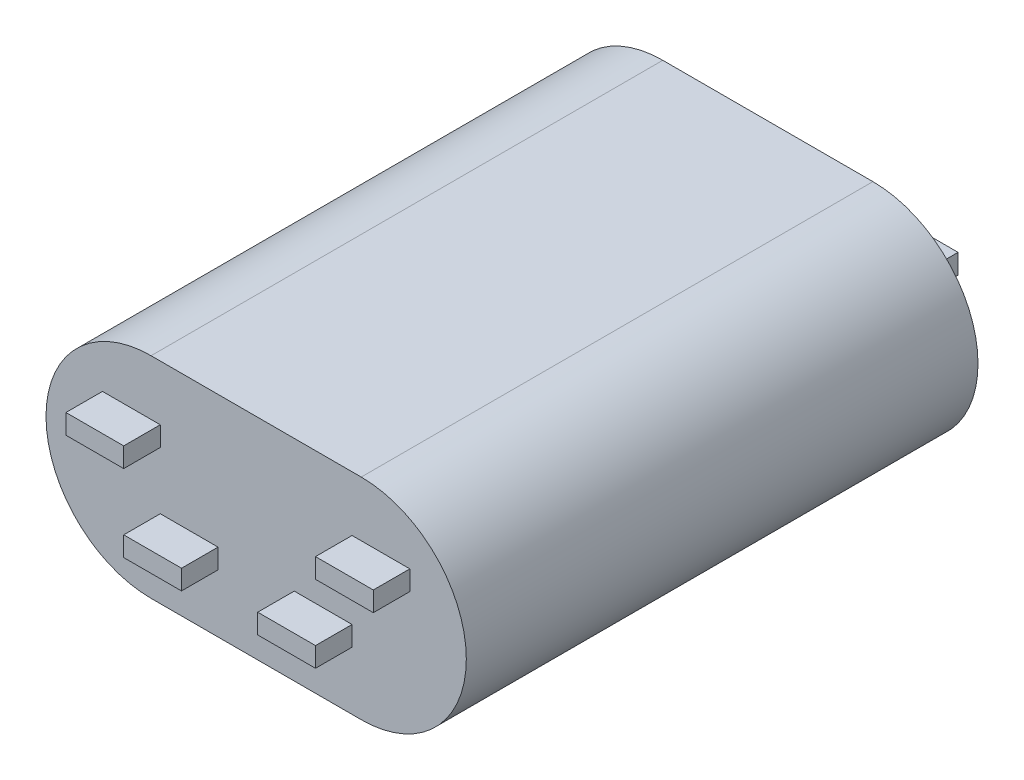
ISO-10303-21;
HEADER;
FILE_DESCRIPTION(('STEP AP214'),'2;1');
FILE_NAME('part.step','',(''),(''),'','','');
FILE_SCHEMA(('AUTOMOTIVE_DESIGN { 1 0 10303 214 1 1 1 1 }'));
ENDSEC;
DATA;
#1=APPLICATION_CONTEXT('core data for automotive mechanical design processes');
#2=APPLICATION_PROTOCOL_DEFINITION('international standard','automotive_design',2000,#1);
#3=PRODUCT_CONTEXT('',#1,'mechanical');
#4=PRODUCT('Part','Part','',(#3));
#5=PRODUCT_RELATED_PRODUCT_CATEGORY('part','',(#4));
#6=PRODUCT_DEFINITION_FORMATION('','',#4);
#7=PRODUCT_DEFINITION_CONTEXT('part definition',#1,'design');
#8=PRODUCT_DEFINITION('design','',#6,#7);
#9=PRODUCT_DEFINITION_SHAPE('','',#8);
#10=(LENGTH_UNIT() NAMED_UNIT(*) SI_UNIT(.MILLI.,.METRE.));
#11=(NAMED_UNIT(*) PLANE_ANGLE_UNIT() SI_UNIT($,.RADIAN.));
#12=(NAMED_UNIT(*) SI_UNIT($,.STERADIAN.) SOLID_ANGLE_UNIT());
#13=UNCERTAINTY_MEASURE_WITH_UNIT(LENGTH_MEASURE(1.E-05),#10,'distance_accuracy_value','');
#14=(GEOMETRIC_REPRESENTATION_CONTEXT(3) GLOBAL_UNCERTAINTY_ASSIGNED_CONTEXT((#13)) GLOBAL_UNIT_ASSIGNED_CONTEXT((#10,
#11,#12)) REPRESENTATION_CONTEXT('',''));
#15=CARTESIAN_POINT('',(0.,0.,0.));
#16=DIRECTION('',(0.,0.,1.));
#17=DIRECTION('',(1.,0.,0.));
#18=AXIS2_PLACEMENT_3D('',#15,#16,#17);
#19=CARTESIAN_POINT('',(5.75,8.75,30.));
#20=DIRECTION('',(0.,0.,-1.));
#21=DIRECTION('',(-1.,0.,0.));
#22=AXIS2_PLACEMENT_3D('',#19,#20,#21);
#23=CYLINDRICAL_SURFACE('',#22,5.75);
#24=CARTESIAN_POINT('',(5.75,8.75,2.));
#25=DIRECTION('',(0.,0.,1.));
#26=DIRECTION('',(1.,0.,0.));
#27=AXIS2_PLACEMENT_3D('',#24,#25,#26);
#28=CIRCLE('',#27,5.75);
#29=CARTESIAN_POINT('',(5.75,3.,2.));
#30=VERTEX_POINT('',#29);
#31=CARTESIAN_POINT('',(5.75,14.5,2.));
#32=VERTEX_POINT('',#31);
#33=EDGE_CURVE('E486',#30,#32,#28,.T.);
#34=ORIENTED_EDGE('',*,*,#33,.T.);
#35=DIRECTION('',(0.,0.,-1.));
#36=VECTOR('',#35,1.);
#37=CARTESIAN_POINT('',(5.75,14.5,30.));
#38=LINE('',#37,#36);
#39=CARTESIAN_POINT('',(5.75,14.5,30.));
#40=VERTEX_POINT('',#39);
#41=EDGE_CURVE('E513',#40,#32,#38,.T.);
#42=ORIENTED_EDGE('',*,*,#41,.F.);
#43=CARTESIAN_POINT('',(5.75,8.75,30.));
#44=DIRECTION('',(0.,0.,1.));
#45=DIRECTION('',(1.,0.,0.));
#46=AXIS2_PLACEMENT_3D('',#43,#44,#45);
#47=CIRCLE('',#46,5.75);
#48=CARTESIAN_POINT('',(5.75,3.,30.));
#49=VERTEX_POINT('',#48);
#50=EDGE_CURVE('E487',#49,#40,#47,.T.);
#51=ORIENTED_EDGE('',*,*,#50,.F.);
#52=DIRECTION('',(0.,0.,-1.));
#53=VECTOR('',#52,1.);
#54=CARTESIAN_POINT('',(5.75,3.,30.));
#55=LINE('',#54,#53);
#56=EDGE_CURVE('E497',#49,#30,#55,.T.);
#57=ORIENTED_EDGE('',*,*,#56,.T.);
#58=EDGE_LOOP('',(#34,#42,#51,#57));
#59=FACE_BOUND('',#58,.T.);
#60=ADVANCED_FACE('F41',(#59),#23,.T.);
#61=CARTESIAN_POINT('',(5.75,14.5,30.));
#62=DIRECTION('',(0.,-1.,0.));
#63=DIRECTION('',(1.,0.,0.));
#64=AXIS2_PLACEMENT_3D('',#61,#62,#63);
#65=PLANE('',#64);
#66=DIRECTION('',(-1.,0.,0.));
#67=VECTOR('',#66,1.);
#68=CARTESIAN_POINT('',(5.75,14.5,2.));
#69=LINE('',#68,#67);
#70=CARTESIAN_POINT('',(-5.74999999999999,14.5,2.));
#71=VERTEX_POINT('',#70);
#72=EDGE_CURVE('E500',#32,#71,#69,.T.);
#73=ORIENTED_EDGE('',*,*,#72,.T.);
#74=DIRECTION('',(0.,0.,-1.));
#75=VECTOR('',#74,1.);
#76=CARTESIAN_POINT('',(-5.74999999999999,14.5,30.));
#77=LINE('',#76,#75);
#78=CARTESIAN_POINT('',(-5.74999999999999,14.5,30.));
#79=VERTEX_POINT('',#78);
#80=EDGE_CURVE('E510',#79,#71,#77,.T.);
#81=ORIENTED_EDGE('',*,*,#80,.F.);
#82=DIRECTION('',(-1.,0.,0.));
#83=VECTOR('',#82,1.);
#84=CARTESIAN_POINT('',(5.75,14.5,30.));
#85=LINE('',#84,#83);
#86=EDGE_CURVE('E490',#40,#79,#85,.T.);
#87=ORIENTED_EDGE('',*,*,#86,.F.);
#88=ORIENTED_EDGE('',*,*,#41,.T.);
#89=EDGE_LOOP('',(#73,#81,#87,#88));
#90=FACE_BOUND('',#89,.T.);
#91=ADVANCED_FACE('F579',(#90),#65,.F.);
#92=CARTESIAN_POINT('',(-5.74999999999999,8.75,30.));
#93=DIRECTION('',(0.,0.,-1.));
#94=DIRECTION('',(-1.,0.,0.));
#95=AXIS2_PLACEMENT_3D('',#92,#93,#94);
#96=CYLINDRICAL_SURFACE('',#95,5.75);
#97=CARTESIAN_POINT('',(-5.74999999999999,8.75,2.));
#98=DIRECTION('',(0.,0.,1.));
#99=DIRECTION('',(1.,0.,0.));
#100=AXIS2_PLACEMENT_3D('',#97,#98,#99);
#101=CIRCLE('',#100,5.75);
#102=CARTESIAN_POINT('',(-5.74999999999999,3.,2.));
#103=VERTEX_POINT('',#102);
#104=EDGE_CURVE('E502',#71,#103,#101,.T.);
#105=ORIENTED_EDGE('',*,*,#104,.T.);
#106=DIRECTION('',(0.,0.,-1.));
#107=VECTOR('',#106,1.);
#108=CARTESIAN_POINT('',(-5.74999999999999,3.,30.));
#109=LINE('',#108,#107);
#110=CARTESIAN_POINT('',(-5.74999999999999,3.,30.));
#111=VERTEX_POINT('',#110);
#112=EDGE_CURVE('E507',#111,#103,#109,.T.);
#113=ORIENTED_EDGE('',*,*,#112,.F.);
#114=CARTESIAN_POINT('',(-5.74999999999999,8.75,30.));
#115=DIRECTION('',(0.,0.,1.));
#116=DIRECTION('',(1.,0.,0.));
#117=AXIS2_PLACEMENT_3D('',#114,#115,#116);
#118=CIRCLE('',#117,5.75);
#119=EDGE_CURVE('E493',#79,#111,#118,.T.);
#120=ORIENTED_EDGE('',*,*,#119,.F.);
#121=ORIENTED_EDGE('',*,*,#80,.T.);
#122=EDGE_LOOP('',(#105,#113,#120,#121));
#123=FACE_BOUND('',#122,.T.);
#124=ADVANCED_FACE('F584',(#123),#96,.T.);
#125=CARTESIAN_POINT('',(-5.74999999999999,3.,30.));
#126=DIRECTION('',(0.,1.,0.));
#127=DIRECTION('',(0.,0.,1.));
#128=AXIS2_PLACEMENT_3D('',#125,#126,#127);
#129=PLANE('',#128);
#130=DIRECTION('',(1.,0.,0.));
#131=VECTOR('',#130,1.);
#132=CARTESIAN_POINT('',(-5.74999999999999,3.,2.));
#133=LINE('',#132,#131);
#134=EDGE_CURVE('E491',#103,#30,#133,.T.);
#135=ORIENTED_EDGE('',*,*,#134,.T.);
#136=ORIENTED_EDGE('',*,*,#56,.F.);
#137=DIRECTION('',(1.,0.,0.));
#138=VECTOR('',#137,1.);
#139=CARTESIAN_POINT('',(-5.74999999999999,3.,30.));
#140=LINE('',#139,#138);
#141=EDGE_CURVE('E495',#111,#49,#140,.T.);
#142=ORIENTED_EDGE('',*,*,#141,.F.);
#143=ORIENTED_EDGE('',*,*,#112,.T.);
#144=EDGE_LOOP('',(#135,#136,#142,#143));
#145=FACE_BOUND('',#144,.T.);
#146=ADVANCED_FACE('F600',(#145),#129,.F.);
#147=CARTESIAN_POINT('',(5.75,8.75,30.));
#148=DIRECTION('',(0.,0.,1.));
#149=DIRECTION('',(1.,0.,0.));
#150=AXIS2_PLACEMENT_3D('',#147,#148,#149);
#151=PLANE('',#150);
#152=DIRECTION('',(1.,0.,0.));
#153=VECTOR('',#152,1.);
#154=CARTESIAN_POINT('',(5.75,10.4014792048601,30.));
#155=LINE('',#154,#153);
#156=CARTESIAN_POINT('',(-8.40966006446434,10.4014792048601,30.));
#157=VERTEX_POINT('',#156);
#158=CARTESIAN_POINT('',(-5.24725307643457,10.4014792048601,30.));
#159=VERTEX_POINT('',#158);
#160=EDGE_CURVE('E55',#157,#159,#155,.T.);
#161=ORIENTED_EDGE('',*,*,#160,.F.);
#162=DIRECTION('',(0.,-1.,0.));
#163=VECTOR('',#162,1.);
#164=CARTESIAN_POINT('',(-8.40966006446434,8.75,30.));
#165=LINE('',#164,#163);
#166=CARTESIAN_POINT('',(-8.40966006446434,11.479040104485,30.));
#167=VERTEX_POINT('',#166);
#168=EDGE_CURVE('E59',#167,#157,#165,.T.);
#169=ORIENTED_EDGE('',*,*,#168,.F.);
#170=DIRECTION('',(-1.,0.,0.));
#171=VECTOR('',#170,1.);
#172=CARTESIAN_POINT('',(5.75,11.479040104485,30.));
#173=LINE('',#172,#171);
#174=CARTESIAN_POINT('',(-5.24725307643457,11.479040104485,30.));
#175=VERTEX_POINT('',#174);
#176=EDGE_CURVE('E326',#175,#167,#173,.T.);
#177=ORIENTED_EDGE('',*,*,#176,.F.);
#178=DIRECTION('',(0.,1.,0.));
#179=VECTOR('',#178,1.);
#180=CARTESIAN_POINT('',(-5.24725307643457,8.74999999999999,30.));
#181=LINE('',#180,#179);
#182=EDGE_CURVE('E323',#159,#175,#181,.T.);
#183=ORIENTED_EDGE('',*,*,#182,.F.);
#184=EDGE_LOOP('',(#161,#169,#177,#183));
#185=FACE_BOUND('',#184,.T.);
#186=DIRECTION('',(1.,0.,0.));
#187=VECTOR('',#186,1.);
#188=CARTESIAN_POINT('',(5.75,6.18493655415374,30.));
#189=LINE('',#188,#187);
#190=CARTESIAN_POINT('',(-5.24725307643457,6.18493655415374,30.));
#191=VERTEX_POINT('',#190);
#192=CARTESIAN_POINT('',(-2.0848460884048,6.18493655415374,30.));
#193=VERTEX_POINT('',#192);
#194=EDGE_CURVE('E379',#191,#193,#189,.T.);
#195=ORIENTED_EDGE('',*,*,#194,.F.);
#196=DIRECTION('',(0.,-1.,0.));
#197=VECTOR('',#196,1.);
#198=CARTESIAN_POINT('',(-5.24725307643457,8.75,30.));
#199=LINE('',#198,#197);
#200=CARTESIAN_POINT('',(-5.24725307643457,7.2624974537787,30.));
#201=VERTEX_POINT('',#200);
#202=EDGE_CURVE('E376',#201,#191,#199,.T.);
#203=ORIENTED_EDGE('',*,*,#202,.F.);
#204=DIRECTION('',(-1.,0.,0.));
#205=VECTOR('',#204,1.);
#206=CARTESIAN_POINT('',(5.75,7.2624974537787,30.));
#207=LINE('',#206,#205);
#208=CARTESIAN_POINT('',(-2.0848460884048,7.2624974537787,30.));
#209=VERTEX_POINT('',#208);
#210=EDGE_CURVE('E373',#209,#201,#207,.T.);
#211=ORIENTED_EDGE('',*,*,#210,.F.);
#212=DIRECTION('',(0.,1.,0.));
#213=VECTOR('',#212,1.);
#214=CARTESIAN_POINT('',(-2.0848460884048,8.75,30.));
#215=LINE('',#214,#213);
#216=EDGE_CURVE('E370',#193,#209,#215,.T.);
#217=ORIENTED_EDGE('',*,*,#216,.F.);
#218=EDGE_LOOP('',(#195,#203,#211,#217));
#219=FACE_BOUND('',#218,.T.);
#220=DIRECTION('',(1.,0.,0.));
#221=VECTOR('',#220,1.);
#222=CARTESIAN_POINT('',(5.75,6.18493655415374,30.));
#223=LINE('',#222,#221);
#224=CARTESIAN_POINT('',(2.08484608840481,6.18493655415374,30.));
#225=VERTEX_POINT('',#224);
#226=CARTESIAN_POINT('',(5.24725307643458,6.18493655415374,30.));
#227=VERTEX_POINT('',#226);
#228=EDGE_CURVE('E431',#225,#227,#223,.T.);
#229=ORIENTED_EDGE('',*,*,#228,.F.);
#230=DIRECTION('',(0.,-1.,0.));
#231=VECTOR('',#230,1.);
#232=CARTESIAN_POINT('',(2.08484608840481,8.75,30.));
#233=LINE('',#232,#231);
#234=CARTESIAN_POINT('',(2.08484608840481,7.2624974537787,30.));
#235=VERTEX_POINT('',#234);
#236=EDGE_CURVE('E428',#235,#225,#233,.T.);
#237=ORIENTED_EDGE('',*,*,#236,.F.);
#238=DIRECTION('',(-1.,0.,0.));
#239=VECTOR('',#238,1.);
#240=CARTESIAN_POINT('',(5.75,7.2624974537787,30.));
#241=LINE('',#240,#239);
#242=CARTESIAN_POINT('',(5.24725307643458,7.2624974537787,30.));
#243=VERTEX_POINT('',#242);
#244=EDGE_CURVE('E425',#243,#235,#241,.T.);
#245=ORIENTED_EDGE('',*,*,#244,.F.);
#246=DIRECTION('',(0.,1.,0.));
#247=VECTOR('',#246,1.);
#248=CARTESIAN_POINT('',(5.24725307643458,8.75,30.));
#249=LINE('',#248,#247);
#250=EDGE_CURVE('E422',#227,#243,#249,.T.);
#251=ORIENTED_EDGE('',*,*,#250,.F.);
#252=EDGE_LOOP('',(#229,#237,#245,#251));
#253=FACE_BOUND('',#252,.T.);
#254=DIRECTION('',(1.,0.,0.));
#255=VECTOR('',#254,1.);
#256=CARTESIAN_POINT('',(5.75,10.4014792048601,30.));
#257=LINE('',#256,#255);
#258=CARTESIAN_POINT('',(5.24725307643458,10.4014792048601,30.));
#259=VERTEX_POINT('',#258);
#260=CARTESIAN_POINT('',(8.40966006446435,10.4014792048601,30.));
#261=VERTEX_POINT('',#260);
#262=EDGE_CURVE('E483',#259,#261,#257,.T.);
#263=ORIENTED_EDGE('',*,*,#262,.F.);
#264=DIRECTION('',(0.,-1.,0.));
#265=VECTOR('',#264,1.);
#266=CARTESIAN_POINT('',(5.24725307643458,8.75,30.));
#267=LINE('',#266,#265);
#268=CARTESIAN_POINT('',(5.24725307643458,11.479040104485,30.));
#269=VERTEX_POINT('',#268);
#270=EDGE_CURVE('E480',#269,#259,#267,.T.);
#271=ORIENTED_EDGE('',*,*,#270,.F.);
#272=DIRECTION('',(-1.,0.,0.));
#273=VECTOR('',#272,1.);
#274=CARTESIAN_POINT('',(5.75,11.479040104485,30.));
#275=LINE('',#274,#273);
#276=CARTESIAN_POINT('',(8.40966006446435,11.479040104485,30.));
#277=VERTEX_POINT('',#276);
#278=EDGE_CURVE('E477',#277,#269,#275,.T.);
#279=ORIENTED_EDGE('',*,*,#278,.F.);
#280=DIRECTION('',(0.,1.,0.));
#281=VECTOR('',#280,1.);
#282=CARTESIAN_POINT('',(8.40966006446435,8.75,30.));
#283=LINE('',#282,#281);
#284=EDGE_CURVE('E474',#261,#277,#283,.T.);
#285=ORIENTED_EDGE('',*,*,#284,.F.);
#286=EDGE_LOOP('',(#263,#271,#279,#285));
#287=FACE_BOUND('',#286,.T.);
#288=ORIENTED_EDGE('',*,*,#50,.T.);
#289=ORIENTED_EDGE('',*,*,#86,.T.);
#290=ORIENTED_EDGE('',*,*,#119,.T.);
#291=ORIENTED_EDGE('',*,*,#141,.T.);
#292=EDGE_LOOP('',(#288,#289,#290,#291));
#293=FACE_BOUND('',#292,.T.);
#294=ADVANCED_FACE('F596',(#185,#219,#253,#287,#293),#151,.T.);
#295=CARTESIAN_POINT('',(5.75,8.75,2.));
#296=DIRECTION('',(0.,0.,1.));
#297=DIRECTION('',(1.,0.,0.));
#298=AXIS2_PLACEMENT_3D('',#295,#296,#297);
#299=PLANE('',#298);
#300=DIRECTION('',(0.,-1.,0.));
#301=VECTOR('',#300,1.);
#302=CARTESIAN_POINT('',(-8.40966006446434,8.75,2.));
#303=LINE('',#302,#301);
#304=CARTESIAN_POINT('',(-8.40966006446434,11.479040104485,2.));
#305=VERTEX_POINT('',#304);
#306=CARTESIAN_POINT('',(-8.40966006446434,10.4014792048601,2.));
#307=VERTEX_POINT('',#306);
#308=EDGE_CURVE('E48',#305,#307,#303,.T.);
#309=ORIENTED_EDGE('',*,*,#308,.T.);
#310=DIRECTION('',(1.,0.,0.));
#311=VECTOR('',#310,1.);
#312=CARTESIAN_POINT('',(5.75,10.4014792048601,2.));
#313=LINE('',#312,#311);
#314=CARTESIAN_POINT('',(-5.24725307643457,10.4014792048601,2.));
#315=VERTEX_POINT('',#314);
#316=EDGE_CURVE('E12',#307,#315,#313,.T.);
#317=ORIENTED_EDGE('',*,*,#316,.T.);
#318=DIRECTION('',(0.,1.,0.));
#319=VECTOR('',#318,1.);
#320=CARTESIAN_POINT('',(-5.24725307643457,8.74999999999999,2.));
#321=LINE('',#320,#319);
#322=CARTESIAN_POINT('',(-5.24725307643457,11.479040104485,2.));
#323=VERTEX_POINT('',#322);
#324=EDGE_CURVE('E277',#315,#323,#321,.T.);
#325=ORIENTED_EDGE('',*,*,#324,.T.);
#326=DIRECTION('',(-1.,0.,0.));
#327=VECTOR('',#326,1.);
#328=CARTESIAN_POINT('',(5.75,11.479040104485,2.));
#329=LINE('',#328,#327);
#330=EDGE_CURVE('E553',#323,#305,#329,.T.);
#331=ORIENTED_EDGE('',*,*,#330,.T.);
#332=EDGE_LOOP('',(#309,#317,#325,#331));
#333=FACE_BOUND('',#332,.T.);
#334=DIRECTION('',(0.,-1.,0.));
#335=VECTOR('',#334,1.);
#336=CARTESIAN_POINT('',(-5.24725307643457,8.75,2.));
#337=LINE('',#336,#335);
#338=CARTESIAN_POINT('',(-5.24725307643457,7.2624974537787,2.));
#339=VERTEX_POINT('',#338);
#340=CARTESIAN_POINT('',(-5.24725307643457,6.18493655415374,2.));
#341=VERTEX_POINT('',#340);
#342=EDGE_CURVE('E546',#339,#341,#337,.T.);
#343=ORIENTED_EDGE('',*,*,#342,.T.);
#344=DIRECTION('',(1.,0.,0.));
#345=VECTOR('',#344,1.);
#346=CARTESIAN_POINT('',(5.75,6.18493655415374,2.));
#347=LINE('',#346,#345);
#348=CARTESIAN_POINT('',(-2.0848460884048,6.18493655415374,2.));
#349=VERTEX_POINT('',#348);
#350=EDGE_CURVE('E549',#341,#349,#347,.T.);
#351=ORIENTED_EDGE('',*,*,#350,.T.);
#352=DIRECTION('',(0.,1.,0.));
#353=VECTOR('',#352,1.);
#354=CARTESIAN_POINT('',(-2.0848460884048,8.75,2.));
#355=LINE('',#354,#353);
#356=CARTESIAN_POINT('',(-2.0848460884048,7.2624974537787,2.));
#357=VERTEX_POINT('',#356);
#358=EDGE_CURVE('E540',#349,#357,#355,.T.);
#359=ORIENTED_EDGE('',*,*,#358,.T.);
#360=DIRECTION('',(-1.,0.,0.));
#361=VECTOR('',#360,1.);
#362=CARTESIAN_POINT('',(5.75,7.2624974537787,2.));
#363=LINE('',#362,#361);
#364=EDGE_CURVE('E543',#357,#339,#363,.T.);
#365=ORIENTED_EDGE('',*,*,#364,.T.);
#366=EDGE_LOOP('',(#343,#351,#359,#365));
#367=FACE_BOUND('',#366,.T.);
#368=DIRECTION('',(0.,-1.,0.));
#369=VECTOR('',#368,1.);
#370=CARTESIAN_POINT('',(2.08484608840481,8.75,2.));
#371=LINE('',#370,#369);
#372=CARTESIAN_POINT('',(2.08484608840481,7.2624974537787,2.));
#373=VERTEX_POINT('',#372);
#374=CARTESIAN_POINT('',(2.08484608840481,6.18493655415374,2.));
#375=VERTEX_POINT('',#374);
#376=EDGE_CURVE('E534',#373,#375,#371,.T.);
#377=ORIENTED_EDGE('',*,*,#376,.T.);
#378=DIRECTION('',(1.,0.,0.));
#379=VECTOR('',#378,1.);
#380=CARTESIAN_POINT('',(5.75,6.18493655415374,2.));
#381=LINE('',#380,#379);
#382=CARTESIAN_POINT('',(5.24725307643458,6.18493655415374,2.));
#383=VERTEX_POINT('',#382);
#384=EDGE_CURVE('E537',#375,#383,#381,.T.);
#385=ORIENTED_EDGE('',*,*,#384,.T.);
#386=DIRECTION('',(0.,1.,0.));
#387=VECTOR('',#386,1.);
#388=CARTESIAN_POINT('',(5.24725307643458,8.75,2.));
#389=LINE('',#388,#387);
#390=CARTESIAN_POINT('',(5.24725307643458,7.2624974537787,2.));
#391=VERTEX_POINT('',#390);
#392=EDGE_CURVE('E528',#383,#391,#389,.T.);
#393=ORIENTED_EDGE('',*,*,#392,.T.);
#394=DIRECTION('',(-1.,0.,0.));
#395=VECTOR('',#394,1.);
#396=CARTESIAN_POINT('',(5.75,7.2624974537787,2.));
#397=LINE('',#396,#395);
#398=EDGE_CURVE('E531',#391,#373,#397,.T.);
#399=ORIENTED_EDGE('',*,*,#398,.T.);
#400=EDGE_LOOP('',(#377,#385,#393,#399));
#401=FACE_BOUND('',#400,.T.);
#402=DIRECTION('',(0.,-1.,0.));
#403=VECTOR('',#402,1.);
#404=CARTESIAN_POINT('',(5.24725307643458,8.75,2.));
#405=LINE('',#404,#403);
#406=CARTESIAN_POINT('',(5.24725307643458,11.479040104485,2.));
#407=VERTEX_POINT('',#406);
#408=CARTESIAN_POINT('',(5.24725307643458,10.4014792048601,2.));
#409=VERTEX_POINT('',#408);
#410=EDGE_CURVE('E522',#407,#409,#405,.T.);
#411=ORIENTED_EDGE('',*,*,#410,.T.);
#412=DIRECTION('',(1.,0.,0.));
#413=VECTOR('',#412,1.);
#414=CARTESIAN_POINT('',(5.75,10.4014792048601,2.));
#415=LINE('',#414,#413);
#416=CARTESIAN_POINT('',(8.40966006446435,10.4014792048601,2.));
#417=VERTEX_POINT('',#416);
#418=EDGE_CURVE('E525',#409,#417,#415,.T.);
#419=ORIENTED_EDGE('',*,*,#418,.T.);
#420=DIRECTION('',(0.,1.,0.));
#421=VECTOR('',#420,1.);
#422=CARTESIAN_POINT('',(8.40966006446435,8.75,2.));
#423=LINE('',#422,#421);
#424=CARTESIAN_POINT('',(8.40966006446435,11.479040104485,2.));
#425=VERTEX_POINT('',#424);
#426=EDGE_CURVE('E516',#417,#425,#423,.T.);
#427=ORIENTED_EDGE('',*,*,#426,.T.);
#428=DIRECTION('',(-1.,0.,0.));
#429=VECTOR('',#428,1.);
#430=CARTESIAN_POINT('',(5.75,11.479040104485,2.));
#431=LINE('',#430,#429);
#432=EDGE_CURVE('E519',#425,#407,#431,.T.);
#433=ORIENTED_EDGE('',*,*,#432,.T.);
#434=EDGE_LOOP('',(#411,#419,#427,#433));
#435=FACE_BOUND('',#434,.T.);
#436=ORIENTED_EDGE('',*,*,#33,.F.);
#437=ORIENTED_EDGE('',*,*,#134,.F.);
#438=ORIENTED_EDGE('',*,*,#104,.F.);
#439=ORIENTED_EDGE('',*,*,#72,.F.);
#440=EDGE_LOOP('',(#436,#437,#438,#439));
#441=FACE_BOUND('',#440,.T.);
#442=ADVANCED_FACE('F557',(#333,#367,#401,#435,#441),#299,.F.);
#443=CARTESIAN_POINT('',(8.40966006446435,10.4014792048601,0.));
#444=DIRECTION('',(0.,0.,-1.));
#445=DIRECTION('',(-1.,0.,0.));
#446=AXIS2_PLACEMENT_3D('',#443,#444,#445);
#447=PLANE('',#446);
#448=DIRECTION('',(0.,-1.,0.));
#449=VECTOR('',#448,1.);
#450=CARTESIAN_POINT('',(8.40966006446435,11.479040104485,0.));
#451=LINE('',#450,#449);
#452=CARTESIAN_POINT('',(8.40966006446435,11.479040104485,0.));
#453=VERTEX_POINT('',#452);
#454=CARTESIAN_POINT('',(8.40966006446435,10.4014792048601,0.));
#455=VERTEX_POINT('',#454);
#456=EDGE_CURVE('E434',#453,#455,#451,.T.);
#457=ORIENTED_EDGE('',*,*,#456,.T.);
#458=DIRECTION('',(-1.,0.,0.));
#459=VECTOR('',#458,1.);
#460=CARTESIAN_POINT('',(8.40966006446435,10.4014792048601,0.));
#461=LINE('',#460,#459);
#462=CARTESIAN_POINT('',(5.24725307643458,10.4014792048601,0.));
#463=VERTEX_POINT('',#462);
#464=EDGE_CURVE('E437',#455,#463,#461,.T.);
#465=ORIENTED_EDGE('',*,*,#464,.T.);
#466=DIRECTION('',(0.,1.,0.));
#467=VECTOR('',#466,1.);
#468=CARTESIAN_POINT('',(5.24725307643458,11.479040104485,0.));
#469=LINE('',#468,#467);
#470=CARTESIAN_POINT('',(5.24725307643458,11.479040104485,0.));
#471=VERTEX_POINT('',#470);
#472=EDGE_CURVE('E440',#463,#471,#469,.T.);
#473=ORIENTED_EDGE('',*,*,#472,.T.);
#474=DIRECTION('',(1.,0.,0.));
#475=VECTOR('',#474,1.);
#476=CARTESIAN_POINT('',(8.40966006446435,11.479040104485,0.));
#477=LINE('',#476,#475);
#478=EDGE_CURVE('E443',#471,#453,#477,.T.);
#479=ORIENTED_EDGE('',*,*,#478,.T.);
#480=EDGE_LOOP('',(#457,#465,#473,#479));
#481=FACE_BOUND('',#480,.T.);
#482=ADVANCED_FACE('F611',(#481),#447,.T.);
#483=CARTESIAN_POINT('',(8.40966006446435,11.479040104485,37.3409512792527));
#484=DIRECTION('',(1.,0.,0.));
#485=DIRECTION('',(0.,0.,-1.));
#486=AXIS2_PLACEMENT_3D('',#483,#484,#485);
#487=PLANE('',#486);
#488=ORIENTED_EDGE('',*,*,#426,.F.);
#489=DIRECTION('',(0.,0.,-1.));
#490=VECTOR('',#489,1.);
#491=CARTESIAN_POINT('',(8.40966006446435,10.4014792048601,37.3409512792527));
#492=LINE('',#491,#490);
#493=EDGE_CURVE('E453',#417,#455,#492,.T.);
#494=ORIENTED_EDGE('',*,*,#493,.T.);
#495=ORIENTED_EDGE('',*,*,#456,.F.);
#496=DIRECTION('',(0.,0.,-1.));
#497=VECTOR('',#496,1.);
#498=CARTESIAN_POINT('',(8.40966006446435,11.479040104485,37.3409512792527));
#499=LINE('',#498,#497);
#500=EDGE_CURVE('E458',#425,#453,#499,.T.);
#501=ORIENTED_EDGE('',*,*,#500,.F.);
#502=EDGE_LOOP('',(#488,#494,#495,#501));
#503=FACE_BOUND('',#502,.T.);
#504=ADVANCED_FACE('F638',(#503),#487,.T.);
#505=CARTESIAN_POINT('',(8.40966006446435,11.479040104485,37.3409512792527));
#506=DIRECTION('',(0.,1.,0.));
#507=DIRECTION('',(0.,0.,1.));
#508=AXIS2_PLACEMENT_3D('',#505,#506,#507);
#509=PLANE('',#508);
#510=ORIENTED_EDGE('',*,*,#432,.F.);
#511=ORIENTED_EDGE('',*,*,#500,.T.);
#512=ORIENTED_EDGE('',*,*,#478,.F.);
#513=DIRECTION('',(0.,0.,-1.));
#514=VECTOR('',#513,1.);
#515=CARTESIAN_POINT('',(5.24725307643458,11.479040104485,37.3409512792527));
#516=LINE('',#515,#514);
#517=EDGE_CURVE('E463',#407,#471,#516,.T.);
#518=ORIENTED_EDGE('',*,*,#517,.F.);
#519=EDGE_LOOP('',(#510,#511,#512,#518));
#520=FACE_BOUND('',#519,.T.);
#521=ADVANCED_FACE('F633',(#520),#509,.T.);
#522=CARTESIAN_POINT('',(5.24725307643458,11.479040104485,37.3409512792527));
#523=DIRECTION('',(-1.,0.,0.));
#524=DIRECTION('',(0.,-1.,0.));
#525=AXIS2_PLACEMENT_3D('',#522,#523,#524);
#526=PLANE('',#525);
#527=ORIENTED_EDGE('',*,*,#410,.F.);
#528=ORIENTED_EDGE('',*,*,#517,.T.);
#529=ORIENTED_EDGE('',*,*,#472,.F.);
#530=DIRECTION('',(0.,0.,-1.));
#531=VECTOR('',#530,1.);
#532=CARTESIAN_POINT('',(5.24725307643458,10.4014792048601,37.3409512792527));
#533=LINE('',#532,#531);
#534=EDGE_CURVE('E449',#409,#463,#533,.T.);
#535=ORIENTED_EDGE('',*,*,#534,.F.);
#536=EDGE_LOOP('',(#527,#528,#529,#535));
#537=FACE_BOUND('',#536,.T.);
#538=ADVANCED_FACE('F628',(#537),#526,.T.);
#539=CARTESIAN_POINT('',(8.40966006446435,10.4014792048601,37.3409512792527));
#540=DIRECTION('',(0.,-1.,0.));
#541=DIRECTION('',(0.,0.,-1.));
#542=AXIS2_PLACEMENT_3D('',#539,#540,#541);
#543=PLANE('',#542);
#544=ORIENTED_EDGE('',*,*,#418,.F.);
#545=ORIENTED_EDGE('',*,*,#534,.T.);
#546=ORIENTED_EDGE('',*,*,#464,.F.);
#547=ORIENTED_EDGE('',*,*,#493,.F.);
#548=EDGE_LOOP('',(#544,#545,#546,#547));
#549=FACE_BOUND('',#548,.T.);
#550=ADVANCED_FACE('F618',(#549),#543,.T.);
#551=CARTESIAN_POINT('',(5.75,8.75,32.));
#552=DIRECTION('',(0.,0.,1.));
#553=DIRECTION('',(1.,0.,0.));
#554=AXIS2_PLACEMENT_3D('',#551,#552,#553);
#555=PLANE('',#554);
#556=DIRECTION('',(0.,-1.,0.));
#557=VECTOR('',#556,1.);
#558=CARTESIAN_POINT('',(8.40966006446435,11.479040104485,32.));
#559=LINE('',#558,#557);
#560=CARTESIAN_POINT('',(8.40966006446435,11.479040104485,32.));
#561=VERTEX_POINT('',#560);
#562=CARTESIAN_POINT('',(8.40966006446435,10.4014792048601,32.));
#563=VERTEX_POINT('',#562);
#564=EDGE_CURVE('E450',#561,#563,#559,.T.);
#565=ORIENTED_EDGE('',*,*,#564,.F.);
#566=DIRECTION('',(1.,0.,0.));
#567=VECTOR('',#566,1.);
#568=CARTESIAN_POINT('',(8.40966006446435,11.479040104485,32.));
#569=LINE('',#568,#567);
#570=CARTESIAN_POINT('',(5.24725307643458,11.479040104485,32.));
#571=VERTEX_POINT('',#570);
#572=EDGE_CURVE('E455',#571,#561,#569,.T.);
#573=ORIENTED_EDGE('',*,*,#572,.F.);
#574=DIRECTION('',(0.,1.,0.));
#575=VECTOR('',#574,1.);
#576=CARTESIAN_POINT('',(5.24725307643458,11.479040104485,32.));
#577=LINE('',#576,#575);
#578=CARTESIAN_POINT('',(5.24725307643458,10.4014792048601,32.));
#579=VERTEX_POINT('',#578);
#580=EDGE_CURVE('E460',#579,#571,#577,.T.);
#581=ORIENTED_EDGE('',*,*,#580,.F.);
#582=DIRECTION('',(-1.,0.,0.));
#583=VECTOR('',#582,1.);
#584=CARTESIAN_POINT('',(8.40966006446435,10.4014792048601,32.));
#585=LINE('',#584,#583);
#586=EDGE_CURVE('E446',#563,#579,#585,.T.);
#587=ORIENTED_EDGE('',*,*,#586,.F.);
#588=EDGE_LOOP('',(#565,#573,#581,#587));
#589=FACE_BOUND('',#588,.T.);
#590=ADVANCED_FACE('F614',(#589),#555,.T.);
#591=EDGE_CURVE('E464',#579,#259,#533,.T.);
#592=ORIENTED_EDGE('',*,*,#591,.T.);
#593=ORIENTED_EDGE('',*,*,#262,.T.);
#594=EDGE_CURVE('E471',#563,#261,#492,.T.);
#595=ORIENTED_EDGE('',*,*,#594,.F.);
#596=ORIENTED_EDGE('',*,*,#586,.T.);
#597=EDGE_LOOP('',(#592,#593,#595,#596));
#598=FACE_BOUND('',#597,.T.);
#599=ADVANCED_FACE('F617',(#598),#543,.T.);
#600=EDGE_CURVE('E459',#571,#269,#516,.T.);
#601=ORIENTED_EDGE('',*,*,#600,.T.);
#602=ORIENTED_EDGE('',*,*,#270,.T.);
#603=ORIENTED_EDGE('',*,*,#591,.F.);
#604=ORIENTED_EDGE('',*,*,#580,.T.);
#605=EDGE_LOOP('',(#601,#602,#603,#604));
#606=FACE_BOUND('',#605,.T.);
#607=ADVANCED_FACE('F622',(#606),#526,.T.);
#608=EDGE_CURVE('E454',#561,#277,#499,.T.);
#609=ORIENTED_EDGE('',*,*,#608,.T.);
#610=ORIENTED_EDGE('',*,*,#278,.T.);
#611=ORIENTED_EDGE('',*,*,#600,.F.);
#612=ORIENTED_EDGE('',*,*,#572,.T.);
#613=EDGE_LOOP('',(#609,#610,#611,#612));
#614=FACE_BOUND('',#613,.T.);
#615=ADVANCED_FACE('F626',(#614),#509,.T.);
#616=ORIENTED_EDGE('',*,*,#594,.T.);
#617=ORIENTED_EDGE('',*,*,#284,.T.);
#618=ORIENTED_EDGE('',*,*,#608,.F.);
#619=ORIENTED_EDGE('',*,*,#564,.T.);
#620=EDGE_LOOP('',(#616,#617,#618,#619));
#621=FACE_BOUND('',#620,.T.);
#622=ADVANCED_FACE('F631',(#621),#487,.T.);
#623=CARTESIAN_POINT('',(5.24725307643458,6.18493655415374,0.));
#624=DIRECTION('',(0.,0.,-1.));
#625=DIRECTION('',(-1.,0.,0.));
#626=AXIS2_PLACEMENT_3D('',#623,#624,#625);
#627=PLANE('',#626);
#628=DIRECTION('',(0.,-1.,0.));
#629=VECTOR('',#628,1.);
#630=CARTESIAN_POINT('',(5.24725307643458,7.2624974537787,0.));
#631=LINE('',#630,#629);
#632=CARTESIAN_POINT('',(5.24725307643458,7.2624974537787,0.));
#633=VERTEX_POINT('',#632);
#634=CARTESIAN_POINT('',(5.24725307643458,6.18493655415374,0.));
#635=VERTEX_POINT('',#634);
#636=EDGE_CURVE('E382',#633,#635,#631,.T.);
#637=ORIENTED_EDGE('',*,*,#636,.T.);
#638=DIRECTION('',(-1.,0.,0.));
#639=VECTOR('',#638,1.);
#640=CARTESIAN_POINT('',(5.24725307643458,6.18493655415374,0.));
#641=LINE('',#640,#639);
#642=CARTESIAN_POINT('',(2.08484608840481,6.18493655415374,0.));
#643=VERTEX_POINT('',#642);
#644=EDGE_CURVE('E385',#635,#643,#641,.T.);
#645=ORIENTED_EDGE('',*,*,#644,.T.);
#646=DIRECTION('',(0.,1.,0.));
#647=VECTOR('',#646,1.);
#648=CARTESIAN_POINT('',(2.08484608840481,7.2624974537787,0.));
#649=LINE('',#648,#647);
#650=CARTESIAN_POINT('',(2.08484608840481,7.2624974537787,0.));
#651=VERTEX_POINT('',#650);
#652=EDGE_CURVE('E388',#643,#651,#649,.T.);
#653=ORIENTED_EDGE('',*,*,#652,.T.);
#654=DIRECTION('',(1.,0.,0.));
#655=VECTOR('',#654,1.);
#656=CARTESIAN_POINT('',(5.24725307643458,7.2624974537787,0.));
#657=LINE('',#656,#655);
#658=EDGE_CURVE('E391',#651,#633,#657,.T.);
#659=ORIENTED_EDGE('',*,*,#658,.T.);
#660=EDGE_LOOP('',(#637,#645,#653,#659));
#661=FACE_BOUND('',#660,.T.);
#662=ADVANCED_FACE('F636',(#661),#627,.T.);
#663=CARTESIAN_POINT('',(5.24725307643458,7.2624974537787,37.3409512792527));
#664=DIRECTION('',(1.,0.,0.));
#665=DIRECTION('',(0.,0.,-1.));
#666=AXIS2_PLACEMENT_3D('',#663,#664,#665);
#667=PLANE('',#666);
#668=ORIENTED_EDGE('',*,*,#392,.F.);
#669=DIRECTION('',(0.,0.,-1.));
#670=VECTOR('',#669,1.);
#671=CARTESIAN_POINT('',(5.24725307643458,6.18493655415374,37.3409512792527));
#672=LINE('',#671,#670);
#673=EDGE_CURVE('E401',#383,#635,#672,.T.);
#674=ORIENTED_EDGE('',*,*,#673,.T.);
#675=ORIENTED_EDGE('',*,*,#636,.F.);
#676=DIRECTION('',(0.,0.,-1.));
#677=VECTOR('',#676,1.);
#678=CARTESIAN_POINT('',(5.24725307643458,7.2624974537787,37.3409512792527));
#679=LINE('',#678,#677);
#680=EDGE_CURVE('E406',#391,#633,#679,.T.);
#681=ORIENTED_EDGE('',*,*,#680,.F.);
#682=EDGE_LOOP('',(#668,#674,#675,#681));
#683=FACE_BOUND('',#682,.T.);
#684=ADVANCED_FACE('F666',(#683),#667,.T.);
#685=CARTESIAN_POINT('',(5.24725307643458,7.2624974537787,37.3409512792527));
#686=DIRECTION('',(0.,1.,0.));
#687=DIRECTION('',(0.,0.,1.));
#688=AXIS2_PLACEMENT_3D('',#685,#686,#687);
#689=PLANE('',#688);
#690=ORIENTED_EDGE('',*,*,#398,.F.);
#691=ORIENTED_EDGE('',*,*,#680,.T.);
#692=ORIENTED_EDGE('',*,*,#658,.F.);
#693=DIRECTION('',(0.,0.,-1.));
#694=VECTOR('',#693,1.);
#695=CARTESIAN_POINT('',(2.08484608840481,7.2624974537787,37.3409512792527));
#696=LINE('',#695,#694);
#697=EDGE_CURVE('E411',#373,#651,#696,.T.);
#698=ORIENTED_EDGE('',*,*,#697,.F.);
#699=EDGE_LOOP('',(#690,#691,#692,#698));
#700=FACE_BOUND('',#699,.T.);
#701=ADVANCED_FACE('F661',(#700),#689,.T.);
#702=CARTESIAN_POINT('',(2.08484608840481,7.2624974537787,37.3409512792527));
#703=DIRECTION('',(-1.,0.,0.));
#704=DIRECTION('',(0.,0.,1.));
#705=AXIS2_PLACEMENT_3D('',#702,#703,#704);
#706=PLANE('',#705);
#707=ORIENTED_EDGE('',*,*,#376,.F.);
#708=ORIENTED_EDGE('',*,*,#697,.T.);
#709=ORIENTED_EDGE('',*,*,#652,.F.);
#710=DIRECTION('',(0.,0.,-1.));
#711=VECTOR('',#710,1.);
#712=CARTESIAN_POINT('',(2.08484608840481,6.18493655415374,37.3409512792527));
#713=LINE('',#712,#711);
#714=EDGE_CURVE('E397',#375,#643,#713,.T.);
#715=ORIENTED_EDGE('',*,*,#714,.F.);
#716=EDGE_LOOP('',(#707,#708,#709,#715));
#717=FACE_BOUND('',#716,.T.);
#718=ADVANCED_FACE('F656',(#717),#706,.T.);
#719=CARTESIAN_POINT('',(5.24725307643458,6.18493655415374,37.3409512792527));
#720=DIRECTION('',(0.,-1.,0.));
#721=DIRECTION('',(0.,0.,-1.));
#722=AXIS2_PLACEMENT_3D('',#719,#720,#721);
#723=PLANE('',#722);
#724=ORIENTED_EDGE('',*,*,#384,.F.);
#725=ORIENTED_EDGE('',*,*,#714,.T.);
#726=ORIENTED_EDGE('',*,*,#644,.F.);
#727=ORIENTED_EDGE('',*,*,#673,.F.);
#728=EDGE_LOOP('',(#724,#725,#726,#727));
#729=FACE_BOUND('',#728,.T.);
#730=ADVANCED_FACE('F646',(#729),#723,.T.);
#731=CARTESIAN_POINT('',(5.75,8.75,32.));
#732=DIRECTION('',(0.,0.,1.));
#733=DIRECTION('',(1.,0.,0.));
#734=AXIS2_PLACEMENT_3D('',#731,#732,#733);
#735=PLANE('',#734);
#736=DIRECTION('',(0.,-1.,0.));
#737=VECTOR('',#736,1.);
#738=CARTESIAN_POINT('',(5.24725307643458,7.2624974537787,32.));
#739=LINE('',#738,#737);
#740=CARTESIAN_POINT('',(5.24725307643458,7.2624974537787,32.));
#741=VERTEX_POINT('',#740);
#742=CARTESIAN_POINT('',(5.24725307643458,6.18493655415374,32.));
#743=VERTEX_POINT('',#742);
#744=EDGE_CURVE('E398',#741,#743,#739,.T.);
#745=ORIENTED_EDGE('',*,*,#744,.F.);
#746=DIRECTION('',(1.,0.,0.));
#747=VECTOR('',#746,1.);
#748=CARTESIAN_POINT('',(5.24725307643458,7.2624974537787,32.));
#749=LINE('',#748,#747);
#750=CARTESIAN_POINT('',(2.08484608840481,7.2624974537787,32.));
#751=VERTEX_POINT('',#750);
#752=EDGE_CURVE('E403',#751,#741,#749,.T.);
#753=ORIENTED_EDGE('',*,*,#752,.F.);
#754=DIRECTION('',(0.,1.,0.));
#755=VECTOR('',#754,1.);
#756=CARTESIAN_POINT('',(2.08484608840481,7.2624974537787,32.));
#757=LINE('',#756,#755);
#758=CARTESIAN_POINT('',(2.08484608840481,6.18493655415374,32.));
#759=VERTEX_POINT('',#758);
#760=EDGE_CURVE('E408',#759,#751,#757,.T.);
#761=ORIENTED_EDGE('',*,*,#760,.F.);
#762=DIRECTION('',(-1.,0.,0.));
#763=VECTOR('',#762,1.);
#764=CARTESIAN_POINT('',(5.24725307643458,6.18493655415374,32.));
#765=LINE('',#764,#763);
#766=EDGE_CURVE('E394',#743,#759,#765,.T.);
#767=ORIENTED_EDGE('',*,*,#766,.F.);
#768=EDGE_LOOP('',(#745,#753,#761,#767));
#769=FACE_BOUND('',#768,.T.);
#770=ADVANCED_FACE('F642',(#769),#735,.T.);
#771=EDGE_CURVE('E412',#759,#225,#713,.T.);
#772=ORIENTED_EDGE('',*,*,#771,.T.);
#773=ORIENTED_EDGE('',*,*,#228,.T.);
#774=EDGE_CURVE('E419',#743,#227,#672,.T.);
#775=ORIENTED_EDGE('',*,*,#774,.F.);
#776=ORIENTED_EDGE('',*,*,#766,.T.);
#777=EDGE_LOOP('',(#772,#773,#775,#776));
#778=FACE_BOUND('',#777,.T.);
#779=ADVANCED_FACE('F645',(#778),#723,.T.);
#780=EDGE_CURVE('E407',#751,#235,#696,.T.);
#781=ORIENTED_EDGE('',*,*,#780,.T.);
#782=ORIENTED_EDGE('',*,*,#236,.T.);
#783=ORIENTED_EDGE('',*,*,#771,.F.);
#784=ORIENTED_EDGE('',*,*,#760,.T.);
#785=EDGE_LOOP('',(#781,#782,#783,#784));
#786=FACE_BOUND('',#785,.T.);
#787=ADVANCED_FACE('F650',(#786),#706,.T.);
#788=EDGE_CURVE('E402',#741,#243,#679,.T.);
#789=ORIENTED_EDGE('',*,*,#788,.T.);
#790=ORIENTED_EDGE('',*,*,#244,.T.);
#791=ORIENTED_EDGE('',*,*,#780,.F.);
#792=ORIENTED_EDGE('',*,*,#752,.T.);
#793=EDGE_LOOP('',(#789,#790,#791,#792));
#794=FACE_BOUND('',#793,.T.);
#795=ADVANCED_FACE('F654',(#794),#689,.T.);
#796=ORIENTED_EDGE('',*,*,#774,.T.);
#797=ORIENTED_EDGE('',*,*,#250,.T.);
#798=ORIENTED_EDGE('',*,*,#788,.F.);
#799=ORIENTED_EDGE('',*,*,#744,.T.);
#800=EDGE_LOOP('',(#796,#797,#798,#799));
#801=FACE_BOUND('',#800,.T.);
#802=ADVANCED_FACE('F659',(#801),#667,.T.);
#803=CARTESIAN_POINT('',(-2.0848460884048,6.18493655415374,0.));
#804=DIRECTION('',(0.,0.,-1.));
#805=DIRECTION('',(-1.,0.,0.));
#806=AXIS2_PLACEMENT_3D('',#803,#804,#805);
#807=PLANE('',#806);
#808=DIRECTION('',(0.,-1.,0.));
#809=VECTOR('',#808,1.);
#810=CARTESIAN_POINT('',(-2.0848460884048,7.2624974537787,0.));
#811=LINE('',#810,#809);
#812=CARTESIAN_POINT('',(-2.0848460884048,7.2624974537787,0.));
#813=VERTEX_POINT('',#812);
#814=CARTESIAN_POINT('',(-2.0848460884048,6.18493655415374,0.));
#815=VERTEX_POINT('',#814);
#816=EDGE_CURVE('E330',#813,#815,#811,.T.);
#817=ORIENTED_EDGE('',*,*,#816,.T.);
#818=DIRECTION('',(-1.,0.,0.));
#819=VECTOR('',#818,1.);
#820=CARTESIAN_POINT('',(-2.0848460884048,6.18493655415374,0.));
#821=LINE('',#820,#819);
#822=CARTESIAN_POINT('',(-5.24725307643457,6.18493655415374,0.));
#823=VERTEX_POINT('',#822);
#824=EDGE_CURVE('E333',#815,#823,#821,.T.);
#825=ORIENTED_EDGE('',*,*,#824,.T.);
#826=DIRECTION('',(0.,1.,0.));
#827=VECTOR('',#826,1.);
#828=CARTESIAN_POINT('',(-5.24725307643457,7.2624974537787,0.));
#829=LINE('',#828,#827);
#830=CARTESIAN_POINT('',(-5.24725307643457,7.2624974537787,0.));
#831=VERTEX_POINT('',#830);
#832=EDGE_CURVE('E336',#823,#831,#829,.T.);
#833=ORIENTED_EDGE('',*,*,#832,.T.);
#834=DIRECTION('',(1.,0.,0.));
#835=VECTOR('',#834,1.);
#836=CARTESIAN_POINT('',(-2.0848460884048,7.2624974537787,0.));
#837=LINE('',#836,#835);
#838=EDGE_CURVE('E339',#831,#813,#837,.T.);
#839=ORIENTED_EDGE('',*,*,#838,.T.);
#840=EDGE_LOOP('',(#817,#825,#833,#839));
#841=FACE_BOUND('',#840,.T.);
#842=ADVANCED_FACE('F664',(#841),#807,.T.);
#843=CARTESIAN_POINT('',(-2.0848460884048,7.2624974537787,37.3409512792527));
#844=DIRECTION('',(1.,0.,0.));
#845=DIRECTION('',(0.,0.,-1.));
#846=AXIS2_PLACEMENT_3D('',#843,#844,#845);
#847=PLANE('',#846);
#848=ORIENTED_EDGE('',*,*,#358,.F.);
#849=DIRECTION('',(0.,0.,-1.));
#850=VECTOR('',#849,1.);
#851=CARTESIAN_POINT('',(-2.0848460884048,6.18493655415374,37.3409512792527));
#852=LINE('',#851,#850);
#853=EDGE_CURVE('E349',#349,#815,#852,.T.);
#854=ORIENTED_EDGE('',*,*,#853,.T.);
#855=ORIENTED_EDGE('',*,*,#816,.F.);
#856=DIRECTION('',(0.,0.,-1.));
#857=VECTOR('',#856,1.);
#858=CARTESIAN_POINT('',(-2.0848460884048,7.2624974537787,37.3409512792527));
#859=LINE('',#858,#857);
#860=EDGE_CURVE('E354',#357,#813,#859,.T.);
#861=ORIENTED_EDGE('',*,*,#860,.F.);
#862=EDGE_LOOP('',(#848,#854,#855,#861));
#863=FACE_BOUND('',#862,.T.);
#864=ADVANCED_FACE('F693',(#863),#847,.T.);
#865=CARTESIAN_POINT('',(-2.0848460884048,7.2624974537787,37.3409512792527));
#866=DIRECTION('',(0.,1.,0.));
#867=DIRECTION('',(0.,0.,1.));
#868=AXIS2_PLACEMENT_3D('',#865,#866,#867);
#869=PLANE('',#868);
#870=ORIENTED_EDGE('',*,*,#364,.F.);
#871=ORIENTED_EDGE('',*,*,#860,.T.);
#872=ORIENTED_EDGE('',*,*,#838,.F.);
#873=DIRECTION('',(0.,0.,-1.));
#874=VECTOR('',#873,1.);
#875=CARTESIAN_POINT('',(-5.24725307643457,7.2624974537787,37.3409512792527));
#876=LINE('',#875,#874);
#877=EDGE_CURVE('E359',#339,#831,#876,.T.);
#878=ORIENTED_EDGE('',*,*,#877,.F.);
#879=EDGE_LOOP('',(#870,#871,#872,#878));
#880=FACE_BOUND('',#879,.T.);
#881=ADVANCED_FACE('F689',(#880),#869,.T.);
#882=CARTESIAN_POINT('',(-5.24725307643457,7.2624974537787,37.3409512792527));
#883=DIRECTION('',(-1.,0.,0.));
#884=DIRECTION('',(0.,0.,1.));
#885=AXIS2_PLACEMENT_3D('',#882,#883,#884);
#886=PLANE('',#885);
#887=ORIENTED_EDGE('',*,*,#342,.F.);
#888=ORIENTED_EDGE('',*,*,#877,.T.);
#889=ORIENTED_EDGE('',*,*,#832,.F.);
#890=DIRECTION('',(0.,0.,-1.));
#891=VECTOR('',#890,1.);
#892=CARTESIAN_POINT('',(-5.24725307643457,6.18493655415374,37.3409512792527));
#893=LINE('',#892,#891);
#894=EDGE_CURVE('E345',#341,#823,#893,.T.);
#895=ORIENTED_EDGE('',*,*,#894,.F.);
#896=EDGE_LOOP('',(#887,#888,#889,#895));
#897=FACE_BOUND('',#896,.T.);
#898=ADVANCED_FACE('F684',(#897),#886,.T.);
#899=CARTESIAN_POINT('',(-2.0848460884048,6.18493655415374,37.3409512792527));
#900=DIRECTION('',(0.,-1.,0.));
#901=DIRECTION('',(0.,0.,-1.));
#902=AXIS2_PLACEMENT_3D('',#899,#900,#901);
#903=PLANE('',#902);
#904=ORIENTED_EDGE('',*,*,#350,.F.);
#905=ORIENTED_EDGE('',*,*,#894,.T.);
#906=ORIENTED_EDGE('',*,*,#824,.F.);
#907=ORIENTED_EDGE('',*,*,#853,.F.);
#908=EDGE_LOOP('',(#904,#905,#906,#907));
#909=FACE_BOUND('',#908,.T.);
#910=ADVANCED_FACE('F674',(#909),#903,.T.);
#911=CARTESIAN_POINT('',(5.75,8.75,32.));
#912=DIRECTION('',(0.,0.,1.));
#913=DIRECTION('',(1.,0.,0.));
#914=AXIS2_PLACEMENT_3D('',#911,#912,#913);
#915=PLANE('',#914);
#916=DIRECTION('',(0.,-1.,0.));
#917=VECTOR('',#916,1.);
#918=CARTESIAN_POINT('',(-2.0848460884048,7.2624974537787,32.));
#919=LINE('',#918,#917);
#920=CARTESIAN_POINT('',(-2.0848460884048,7.2624974537787,32.));
#921=VERTEX_POINT('',#920);
#922=CARTESIAN_POINT('',(-2.0848460884048,6.18493655415374,32.));
#923=VERTEX_POINT('',#922);
#924=EDGE_CURVE('E346',#921,#923,#919,.T.);
#925=ORIENTED_EDGE('',*,*,#924,.F.);
#926=DIRECTION('',(1.,0.,0.));
#927=VECTOR('',#926,1.);
#928=CARTESIAN_POINT('',(-2.0848460884048,7.2624974537787,32.));
#929=LINE('',#928,#927);
#930=CARTESIAN_POINT('',(-5.24725307643457,7.2624974537787,32.));
#931=VERTEX_POINT('',#930);
#932=EDGE_CURVE('E351',#931,#921,#929,.T.);
#933=ORIENTED_EDGE('',*,*,#932,.F.);
#934=DIRECTION('',(0.,1.,0.));
#935=VECTOR('',#934,1.);
#936=CARTESIAN_POINT('',(-5.24725307643457,7.2624974537787,32.));
#937=LINE('',#936,#935);
#938=CARTESIAN_POINT('',(-5.24725307643457,6.18493655415374,32.));
#939=VERTEX_POINT('',#938);
#940=EDGE_CURVE('E356',#939,#931,#937,.T.);
#941=ORIENTED_EDGE('',*,*,#940,.F.);
#942=DIRECTION('',(-1.,0.,0.));
#943=VECTOR('',#942,1.);
#944=CARTESIAN_POINT('',(-2.0848460884048,6.18493655415374,32.));
#945=LINE('',#944,#943);
#946=EDGE_CURVE('E342',#923,#939,#945,.T.);
#947=ORIENTED_EDGE('',*,*,#946,.F.);
#948=EDGE_LOOP('',(#925,#933,#941,#947));
#949=FACE_BOUND('',#948,.T.);
#950=ADVANCED_FACE('F670',(#949),#915,.T.);
#951=EDGE_CURVE('E360',#939,#191,#893,.T.);
#952=ORIENTED_EDGE('',*,*,#951,.T.);
#953=ORIENTED_EDGE('',*,*,#194,.T.);
#954=EDGE_CURVE('E367',#923,#193,#852,.T.);
#955=ORIENTED_EDGE('',*,*,#954,.F.);
#956=ORIENTED_EDGE('',*,*,#946,.T.);
#957=EDGE_LOOP('',(#952,#953,#955,#956));
#958=FACE_BOUND('',#957,.T.);
#959=ADVANCED_FACE('F673',(#958),#903,.T.);
#960=EDGE_CURVE('E355',#931,#201,#876,.T.);
#961=ORIENTED_EDGE('',*,*,#960,.T.);
#962=ORIENTED_EDGE('',*,*,#202,.T.);
#963=ORIENTED_EDGE('',*,*,#951,.F.);
#964=ORIENTED_EDGE('',*,*,#940,.T.);
#965=EDGE_LOOP('',(#961,#962,#963,#964));
#966=FACE_BOUND('',#965,.T.);
#967=ADVANCED_FACE('F678',(#966),#886,.T.);
#968=EDGE_CURVE('E350',#921,#209,#859,.T.);
#969=ORIENTED_EDGE('',*,*,#968,.T.);
#970=ORIENTED_EDGE('',*,*,#210,.T.);
#971=ORIENTED_EDGE('',*,*,#960,.F.);
#972=ORIENTED_EDGE('',*,*,#932,.T.);
#973=EDGE_LOOP('',(#969,#970,#971,#972));
#974=FACE_BOUND('',#973,.T.);
#975=ADVANCED_FACE('F682',(#974),#869,.T.);
#976=ORIENTED_EDGE('',*,*,#954,.T.);
#977=ORIENTED_EDGE('',*,*,#216,.T.);
#978=ORIENTED_EDGE('',*,*,#968,.F.);
#979=ORIENTED_EDGE('',*,*,#924,.T.);
#980=EDGE_LOOP('',(#976,#977,#978,#979));
#981=FACE_BOUND('',#980,.T.);
#982=ADVANCED_FACE('F687',(#981),#847,.T.);
#983=CARTESIAN_POINT('',(-5.24725307643457,10.4014792048601,0.));
#984=DIRECTION('',(0.,0.,-1.));
#985=DIRECTION('',(-1.,0.,0.));
#986=AXIS2_PLACEMENT_3D('',#983,#984,#985);
#987=PLANE('',#986);
#988=DIRECTION('',(0.,-1.,0.));
#989=VECTOR('',#988,1.);
#990=CARTESIAN_POINT('',(-5.24725307643457,11.479040104485,0.));
#991=LINE('',#990,#989);
#992=CARTESIAN_POINT('',(-5.24725307643457,11.479040104485,0.));
#993=VERTEX_POINT('',#992);
#994=CARTESIAN_POINT('',(-5.24725307643457,10.4014792048601,0.));
#995=VERTEX_POINT('',#994);
#996=EDGE_CURVE('E275',#993,#995,#991,.T.);
#997=ORIENTED_EDGE('',*,*,#996,.T.);
#998=DIRECTION('',(-1.,0.,0.));
#999=VECTOR('',#998,1.);
#1000=CARTESIAN_POINT('',(-5.24725307643457,10.4014792048601,0.));
#1001=LINE('',#1000,#999);
#1002=CARTESIAN_POINT('',(-8.40966006446434,10.4014792048601,0.));
#1003=VERTEX_POINT('',#1002);
#1004=EDGE_CURVE('E283',#995,#1003,#1001,.T.);
#1005=ORIENTED_EDGE('',*,*,#1004,.T.);
#1006=DIRECTION('',(0.,1.,0.));
#1007=VECTOR('',#1006,1.);
#1008=CARTESIAN_POINT('',(-8.40966006446434,11.479040104485,0.));
#1009=LINE('',#1008,#1007);
#1010=CARTESIAN_POINT('',(-8.40966006446434,11.479040104485,0.));
#1011=VERTEX_POINT('',#1010);
#1012=EDGE_CURVE('E290',#1003,#1011,#1009,.T.);
#1013=ORIENTED_EDGE('',*,*,#1012,.T.);
#1014=DIRECTION('',(1.,0.,0.));
#1015=VECTOR('',#1014,1.);
#1016=CARTESIAN_POINT('',(-5.24725307643457,11.479040104485,0.));
#1017=LINE('',#1016,#1015);
#1018=EDGE_CURVE('E295',#1011,#993,#1017,.T.);
#1019=ORIENTED_EDGE('',*,*,#1018,.T.);
#1020=EDGE_LOOP('',(#997,#1005,#1013,#1019));
#1021=FACE_BOUND('',#1020,.T.);
#1022=ADVANCED_FACE('F293',(#1021),#987,.T.);
#1023=CARTESIAN_POINT('',(-5.24725307643457,11.479040104485,37.3409512792527));
#1024=DIRECTION('',(1.,0.,0.));
#1025=DIRECTION('',(0.,1.,0.));
#1026=AXIS2_PLACEMENT_3D('',#1023,#1024,#1025);
#1027=PLANE('',#1026);
#1028=ORIENTED_EDGE('',*,*,#324,.F.);
#1029=DIRECTION('',(0.,0.,-1.));
#1030=VECTOR('',#1029,1.);
#1031=CARTESIAN_POINT('',(-5.24725307643457,10.4014792048601,37.3409512792527));
#1032=LINE('',#1031,#1030);
#1033=EDGE_CURVE('E271',#315,#995,#1032,.T.);
#1034=ORIENTED_EDGE('',*,*,#1033,.T.);
#1035=ORIENTED_EDGE('',*,*,#996,.F.);
#1036=DIRECTION('',(0.,0.,-1.));
#1037=VECTOR('',#1036,1.);
#1038=CARTESIAN_POINT('',(-5.24725307643457,11.479040104485,37.3409512792527));
#1039=LINE('',#1038,#1037);
#1040=EDGE_CURVE('E309',#323,#993,#1039,.T.);
#1041=ORIENTED_EDGE('',*,*,#1040,.F.);
#1042=EDGE_LOOP('',(#1028,#1034,#1035,#1041));
#1043=FACE_BOUND('',#1042,.T.);
#1044=ADVANCED_FACE('F273',(#1043),#1027,.T.);
#1045=CARTESIAN_POINT('',(-5.24725307643457,11.479040104485,37.3409512792527));
#1046=DIRECTION('',(0.,1.,0.));
#1047=DIRECTION('',(0.,0.,1.));
#1048=AXIS2_PLACEMENT_3D('',#1045,#1046,#1047);
#1049=PLANE('',#1048);
#1050=ORIENTED_EDGE('',*,*,#330,.F.);
#1051=ORIENTED_EDGE('',*,*,#1040,.T.);
#1052=ORIENTED_EDGE('',*,*,#1018,.F.);
#1053=DIRECTION('',(0.,0.,-1.));
#1054=VECTOR('',#1053,1.);
#1055=CARTESIAN_POINT('',(-8.40966006446434,11.479040104485,37.3409512792527));
#1056=LINE('',#1055,#1054);
#1057=EDGE_CURVE('E314',#305,#1011,#1056,.T.);
#1058=ORIENTED_EDGE('',*,*,#1057,.F.);
#1059=EDGE_LOOP('',(#1050,#1051,#1052,#1058));
#1060=FACE_BOUND('',#1059,.T.);
#1061=ADVANCED_FACE('F564',(#1060),#1049,.T.);
#1062=CARTESIAN_POINT('',(-8.40966006446434,11.479040104485,37.3409512792527));
#1063=DIRECTION('',(-1.,0.,0.));
#1064=DIRECTION('',(0.,0.,1.));
#1065=AXIS2_PLACEMENT_3D('',#1062,#1063,#1064);
#1066=PLANE('',#1065);
#1067=ORIENTED_EDGE('',*,*,#308,.F.);
#1068=ORIENTED_EDGE('',*,*,#1057,.T.);
#1069=ORIENTED_EDGE('',*,*,#1012,.F.);
#1070=DIRECTION('',(0.,0.,-1.));
#1071=VECTOR('',#1070,1.);
#1072=CARTESIAN_POINT('',(-8.40966006446434,10.4014792048601,37.3409512792527));
#1073=LINE('',#1072,#1071);
#1074=EDGE_CURVE('E286',#307,#1003,#1073,.T.);
#1075=ORIENTED_EDGE('',*,*,#1074,.F.);
#1076=EDGE_LOOP('',(#1067,#1068,#1069,#1075));
#1077=FACE_BOUND('',#1076,.T.);
#1078=ADVANCED_FACE('F562',(#1077),#1066,.T.);
#1079=CARTESIAN_POINT('',(-5.24725307643457,10.4014792048601,37.3409512792527));
#1080=DIRECTION('',(0.,-1.,0.));
#1081=DIRECTION('',(0.,0.,-1.));
#1082=AXIS2_PLACEMENT_3D('',#1079,#1080,#1081);
#1083=PLANE('',#1082);
#1084=ORIENTED_EDGE('',*,*,#316,.F.);
#1085=ORIENTED_EDGE('',*,*,#1074,.T.);
#1086=ORIENTED_EDGE('',*,*,#1004,.F.);
#1087=ORIENTED_EDGE('',*,*,#1033,.F.);
#1088=EDGE_LOOP('',(#1084,#1085,#1086,#1087));
#1089=FACE_BOUND('',#1088,.T.);
#1090=ADVANCED_FACE('F284',(#1089),#1083,.T.);
#1091=CARTESIAN_POINT('',(5.75,8.75,32.));
#1092=DIRECTION('',(0.,0.,1.));
#1093=DIRECTION('',(1.,0.,0.));
#1094=AXIS2_PLACEMENT_3D('',#1091,#1092,#1093);
#1095=PLANE('',#1094);
#1096=DIRECTION('',(0.,-1.,0.));
#1097=VECTOR('',#1096,1.);
#1098=CARTESIAN_POINT('',(-5.24725307643457,11.479040104485,32.));
#1099=LINE('',#1098,#1097);
#1100=CARTESIAN_POINT('',(-5.24725307643457,11.479040104485,32.));
#1101=VERTEX_POINT('',#1100);
#1102=CARTESIAN_POINT('',(-5.24725307643457,10.4014792048601,32.));
#1103=VERTEX_POINT('',#1102);
#1104=EDGE_CURVE('E280',#1101,#1103,#1099,.T.);
#1105=ORIENTED_EDGE('',*,*,#1104,.F.);
#1106=DIRECTION('',(1.,0.,0.));
#1107=VECTOR('',#1106,1.);
#1108=CARTESIAN_POINT('',(-5.24725307643457,11.479040104485,32.));
#1109=LINE('',#1108,#1107);
#1110=CARTESIAN_POINT('',(-8.40966006446434,11.479040104485,32.));
#1111=VERTEX_POINT('',#1110);
#1112=EDGE_CURVE('E306',#1111,#1101,#1109,.T.);
#1113=ORIENTED_EDGE('',*,*,#1112,.F.);
#1114=DIRECTION('',(0.,1.,0.));
#1115=VECTOR('',#1114,1.);
#1116=CARTESIAN_POINT('',(-8.40966006446434,11.479040104485,32.));
#1117=LINE('',#1116,#1115);
#1118=CARTESIAN_POINT('',(-8.40966006446434,10.4014792048601,32.));
#1119=VERTEX_POINT('',#1118);
#1120=EDGE_CURVE('E311',#1119,#1111,#1117,.T.);
#1121=ORIENTED_EDGE('',*,*,#1120,.F.);
#1122=DIRECTION('',(-1.,0.,0.));
#1123=VECTOR('',#1122,1.);
#1124=CARTESIAN_POINT('',(-5.24725307643457,10.4014792048601,32.));
#1125=LINE('',#1124,#1123);
#1126=EDGE_CURVE('E300',#1103,#1119,#1125,.T.);
#1127=ORIENTED_EDGE('',*,*,#1126,.F.);
#1128=EDGE_LOOP('',(#1105,#1113,#1121,#1127));
#1129=FACE_BOUND('',#1128,.T.);
#1130=ADVANCED_FACE('F697',(#1129),#1095,.T.);
#1131=EDGE_CURVE('E315',#1119,#157,#1073,.T.);
#1132=ORIENTED_EDGE('',*,*,#1131,.T.);
#1133=ORIENTED_EDGE('',*,*,#160,.T.);
#1134=EDGE_CURVE('E279',#1103,#159,#1032,.T.);
#1135=ORIENTED_EDGE('',*,*,#1134,.F.);
#1136=ORIENTED_EDGE('',*,*,#1126,.T.);
#1137=EDGE_LOOP('',(#1132,#1133,#1135,#1136));
#1138=FACE_BOUND('',#1137,.T.);
#1139=ADVANCED_FACE('F700',(#1138),#1083,.T.);
#1140=EDGE_CURVE('E310',#1111,#167,#1056,.T.);
#1141=ORIENTED_EDGE('',*,*,#1140,.T.);
#1142=ORIENTED_EDGE('',*,*,#168,.T.);
#1143=ORIENTED_EDGE('',*,*,#1131,.F.);
#1144=ORIENTED_EDGE('',*,*,#1120,.T.);
#1145=EDGE_LOOP('',(#1141,#1142,#1143,#1144));
#1146=FACE_BOUND('',#1145,.T.);
#1147=ADVANCED_FACE('F573',(#1146),#1066,.T.);
#1148=EDGE_CURVE('E305',#1101,#175,#1039,.T.);
#1149=ORIENTED_EDGE('',*,*,#1148,.T.);
#1150=ORIENTED_EDGE('',*,*,#176,.T.);
#1151=ORIENTED_EDGE('',*,*,#1140,.F.);
#1152=ORIENTED_EDGE('',*,*,#1112,.T.);
#1153=EDGE_LOOP('',(#1149,#1150,#1151,#1152));
#1154=FACE_BOUND('',#1153,.T.);
#1155=ADVANCED_FACE('F567',(#1154),#1049,.T.);
#1156=ORIENTED_EDGE('',*,*,#1134,.T.);
#1157=ORIENTED_EDGE('',*,*,#182,.T.);
#1158=ORIENTED_EDGE('',*,*,#1148,.F.);
#1159=ORIENTED_EDGE('',*,*,#1104,.T.);
#1160=EDGE_LOOP('',(#1156,#1157,#1158,#1159));
#1161=FACE_BOUND('',#1160,.T.);
#1162=ADVANCED_FACE('F575',(#1161),#1027,.T.);
#1163=CLOSED_SHELL('',(#60,#91,#124,#146,#294,#442,#482,#504,#521,#538,#550,#590,#599,#607,#615,
#622,#662,#684,#701,#718,#730,#770,#779,#787,#795,#802,#842,#864,#881,#898,#910,#950,#959,#967,
#975,#982,#1022,#1044,#1061,#1078,#1090,#1130,#1139,#1147,#1155,#1162));
#1164=MANIFOLD_SOLID_BREP('B2',#1163);
#1165=ADVANCED_BREP_SHAPE_REPRESENTATION('',(#18,#1164),#14);
#1166=SHAPE_DEFINITION_REPRESENTATION(#9,#1165);
ENDSEC;
END-ISO-10303-21;
